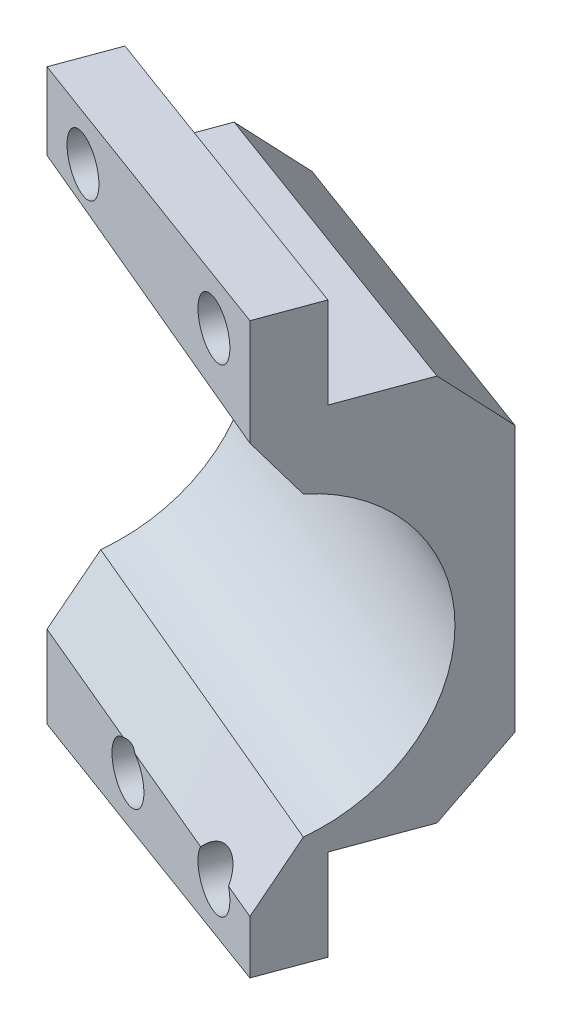
ISO-10303-21;
HEADER;
FILE_DESCRIPTION(('STEP AP214'),'2;1');
FILE_NAME('part.step','',(''),(''),'','','');
FILE_SCHEMA(('AUTOMOTIVE_DESIGN { 1 0 10303 214 1 1 1 1 }'));
ENDSEC;
DATA;
#1=APPLICATION_CONTEXT('core data for automotive mechanical design processes');
#2=APPLICATION_PROTOCOL_DEFINITION('international standard','automotive_design',2000,#1);
#3=PRODUCT_CONTEXT('',#1,'mechanical');
#4=PRODUCT('Part','Part','',(#3));
#5=PRODUCT_RELATED_PRODUCT_CATEGORY('part','',(#4));
#6=PRODUCT_DEFINITION_FORMATION('','',#4);
#7=PRODUCT_DEFINITION_CONTEXT('part definition',#1,'design');
#8=PRODUCT_DEFINITION('design','',#6,#7);
#9=PRODUCT_DEFINITION_SHAPE('','',#8);
#10=(LENGTH_UNIT() NAMED_UNIT(*) SI_UNIT(.MILLI.,.METRE.));
#11=(NAMED_UNIT(*) PLANE_ANGLE_UNIT() SI_UNIT($,.RADIAN.));
#12=(NAMED_UNIT(*) SI_UNIT($,.STERADIAN.) SOLID_ANGLE_UNIT());
#13=UNCERTAINTY_MEASURE_WITH_UNIT(LENGTH_MEASURE(1.E-05),#10,'distance_accuracy_value','');
#14=(GEOMETRIC_REPRESENTATION_CONTEXT(3) GLOBAL_UNCERTAINTY_ASSIGNED_CONTEXT((#13)) GLOBAL_UNIT_ASSIGNED_CONTEXT((#10,
#11,#12)) REPRESENTATION_CONTEXT('',''));
#15=CARTESIAN_POINT('',(0.,0.,0.));
#16=DIRECTION('',(0.,0.,1.));
#17=DIRECTION('',(1.,0.,0.));
#18=AXIS2_PLACEMENT_3D('',#15,#16,#17);
#19=CARTESIAN_POINT('',(5.21894467672447,0.,-14.1596198036222));
#20=DIRECTION('',(0.345836204768251,0.,-0.93829490005621));
#21=DIRECTION('',(-0.93829490005621,0.,-0.345836204768251));
#22=AXIS2_PLACEMENT_3D('',#19,#20,#21);
#23=PLANE('',#22);
#24=CARTESIAN_POINT('',(27.3361977123287,-21.59,-6.00765516087053));
#25=DIRECTION('',(0.345836204768251,0.,-0.93829490005621));
#26=DIRECTION('',(-0.93829490005621,0.,-0.345836204768251));
#27=AXIS2_PLACEMENT_3D('',#24,#25,#26);
#28=CIRCLE('',#27,2.25);
#29=CARTESIAN_POINT('',(25.5723718134735,-20.3535634891508,-6.65776511531612));
#30=VERTEX_POINT('',#29);
#31=CARTESIAN_POINT('',(29.2696260313988,-20.6863734350226,-5.29503324209148));
#32=VERTEX_POINT('',#31);
#33=EDGE_CURVE('E75',#30,#32,#28,.F.);
#34=ORIENTED_EDGE('',*,*,#33,.F.);
#35=CARTESIAN_POINT('',(3.48371722712131,-18.3651246267416,-14.7991889577811));
#36=CARTESIAN_POINT('',(13.4826763632401,-19.2652909730915,-11.113778241959));
#37=CARTESIAN_POINT('',(23.4764153445444,-20.164921543379,-7.43029156785319));
#38=CARTESIAN_POINT('',(33.4648246432216,-21.0640064779739,-3.74876930516191));
#39=B_SPLINE_CURVE_WITH_KNOTS('',3,(#35,#36,#37,#38),.UNSPECIFIED.,.F.,.F.,(4,4),
(4.48806593881346,4.49274774978763),.UNSPECIFIED.);
#40=CARTESIAN_POINT('',(16.8746813355846,-19.570610503947,-9.86355496341381));
#41=VERTEX_POINT('',#40);
#42=EDGE_CURVE('E177',#30,#41,#39,.F.);
#43=ORIENTED_EDGE('',*,*,#42,.T.);
#44=CARTESIAN_POINT('',(15.9436553843669,-21.59,-10.2067119831211));
#45=DIRECTION('',(0.345836204768251,0.,-0.93829490005621));
#46=DIRECTION('',(-0.93829490005621,0.,-0.345836204768251));
#47=AXIS2_PLACEMENT_3D('',#44,#45,#46);
#48=CIRCLE('',#47,2.25);
#49=CARTESIAN_POINT('',(15.3436399883833,-19.4327858878662,-10.4278653191747));
#50=VERTEX_POINT('',#49);
#51=EDGE_CURVE('E68',#41,#50,#48,.T.);
#52=ORIENTED_EDGE('',*,*,#51,.T.);
#53=CARTESIAN_POINT('',(3.48371722712131,-18.3651246267416,-14.7991889577811));
#54=CARTESIAN_POINT('',(13.4826763632401,-19.2652909730915,-11.113778241959));
#55=CARTESIAN_POINT('',(23.4764153445444,-20.164921543379,-7.43029156785319));
#56=CARTESIAN_POINT('',(33.4648246432216,-21.0640064779739,-3.74876930516191));
#57=B_SPLINE_CURVE_WITH_KNOTS('',3,(#53,#54,#55,#56),.UNSPECIFIED.,.F.,.F.,(4,4),
(4.48806593881346,4.49274774978763),.UNSPECIFIED.);
#58=CARTESIAN_POINT('',(5.21894467672446,-18.5213395611403,-14.1596198036222));
#59=VERTEX_POINT('',#58);
#60=EDGE_CURVE('E174',#50,#59,#57,.F.);
#61=ORIENTED_EDGE('',*,*,#60,.T.);
#62=DIRECTION('',(0.,1.,0.));
#63=VECTOR('',#62,1.);
#64=CARTESIAN_POINT('',(5.21894467672446,22.225,-14.1596198036222));
#65=LINE('',#64,#63);
#66=CARTESIAN_POINT('',(5.21894467672446,-25.4,-14.1596198036222));
#67=VERTEX_POINT('',#66);
#68=EDGE_CURVE('E419',#67,#59,#65,.T.);
#69=ORIENTED_EDGE('',*,*,#68,.F.);
#70=DIRECTION('',(-0.93829490005621,0.,-0.345836204768251));
#71=VECTOR('',#70,1.);
#72=CARTESIAN_POINT('',(32.1027358046142,-25.4,-4.25080724064782));
#73=LINE('',#72,#71);
#74=CARTESIAN_POINT('',(32.1027358046142,-25.4,-4.25080724064782));
#75=VERTEX_POINT('',#74);
#76=EDGE_CURVE('E418',#75,#67,#73,.T.);
#77=ORIENTED_EDGE('',*,*,#76,.F.);
#78=DIRECTION('',(0.,-1.,0.));
#79=VECTOR('',#78,1.);
#80=CARTESIAN_POINT('',(32.1027358046142,22.225,-4.25080724064782));
#81=LINE('',#80,#79);
#82=CARTESIAN_POINT('',(32.1027358046142,-20.9414006057597,-4.25080724064782));
#83=VERTEX_POINT('',#82);
#84=EDGE_CURVE('E404',#83,#75,#81,.T.);
#85=ORIENTED_EDGE('',*,*,#84,.F.);
#86=CARTESIAN_POINT('',(3.48371722712131,-18.3651246267416,-14.7991889577811));
#87=CARTESIAN_POINT('',(13.4826763632401,-19.2652909730915,-11.113778241959));
#88=CARTESIAN_POINT('',(23.4764153445444,-20.164921543379,-7.43029156785319));
#89=CARTESIAN_POINT('',(33.4648246432216,-21.0640064779739,-3.74876930516191));
#90=B_SPLINE_CURVE_WITH_KNOTS('',3,(#86,#87,#88,#89),.UNSPECIFIED.,.F.,.F.,(4,4),
(4.48806593881346,4.49274774978763),.UNSPECIFIED.);
#91=EDGE_CURVE('E310',#83,#32,#90,.F.);
#92=ORIENTED_EDGE('',*,*,#91,.T.);
#93=EDGE_LOOP('',(#34,#43,#52,#61,#69,#77,#85,#92));
#94=FACE_BOUND('',#93,.T.);
#95=ADVANCED_FACE('F47',(#94),#23,.F.);
#96=CARTESIAN_POINT('',(5.21894467672446,15.8053970494576,-14.1596198036222));
#97=VERTEX_POINT('',#96);
#98=CARTESIAN_POINT('',(5.21894467672446,22.225,-14.1596198036222));
#99=VERTEX_POINT('',#98);
#100=EDGE_CURVE('E337',#97,#99,#65,.T.);
#101=ORIENTED_EDGE('',*,*,#100,.F.);
#102=CARTESIAN_POINT('',(33.841310333405,13.1942518521345,-3.61000442193104));
#103=CARTESIAN_POINT('',(23.8512512987509,14.1056822711107,-7.29213474337748));
#104=CARTESIAN_POINT('',(13.8558640015298,15.0175328893459,-10.9762289528341));
#105=CARTESIAN_POINT('',(3.85525803950884,15.9297937085494,-14.6622466548176));
#106=B_SPLINE_CURVE_WITH_KNOTS('',3,(#102,#103,#104,#105),.UNSPECIFIED.,.F.,.F.,(4,4),
(1.789867230999,1.79455015070473),.UNSPECIFIED.);
#107=CARTESIAN_POINT('',(32.1027358046142,13.3528678380812,-4.25080724064782));
#108=VERTEX_POINT('',#107);
#109=EDGE_CURVE('E170',#97,#108,#106,.F.);
#110=ORIENTED_EDGE('',*,*,#109,.T.);
#111=CARTESIAN_POINT('',(32.1027358046142,22.225,-4.25080724064782));
#112=VERTEX_POINT('',#111);
#113=EDGE_CURVE('E336',#112,#108,#81,.T.);
#114=ORIENTED_EDGE('',*,*,#113,.F.);
#115=DIRECTION('',(0.93829490005621,0.,0.345836204768251));
#116=VECTOR('',#115,1.);
#117=CARTESIAN_POINT('',(32.1027358046142,22.225,-4.25080724064782));
#118=LINE('',#117,#116);
#119=EDGE_CURVE('E528',#99,#112,#118,.T.);
#120=ORIENTED_EDGE('',*,*,#119,.F.);
#121=EDGE_LOOP('',(#101,#110,#114,#120));
#122=FACE_BOUND('',#121,.T.);
#123=CARTESIAN_POINT('',(27.3361977123287,18.415,-6.00765516087053));
#124=DIRECTION('',(0.345836204768251,0.,-0.93829490005621));
#125=DIRECTION('',(-0.93829490005621,0.,-0.345836204768251));
#126=AXIS2_PLACEMENT_3D('',#123,#124,#125);
#127=CIRCLE('',#126,2.25);
#128=CARTESIAN_POINT('',(25.2250341872022,18.415,-6.7857866215991));
#129=VERTEX_POINT('',#128);
#130=EDGE_CURVE('E511',#129,#129,#127,.F.);
#131=ORIENTED_EDGE('',*,*,#130,.F.);
#132=EDGE_LOOP('',(#131));
#133=FACE_BOUND('',#132,.T.);
#134=CARTESIAN_POINT('',(9.98548276901002,18.415,-12.4027718833995));
#135=DIRECTION('',(0.345836204768251,0.,-0.93829490005621));
#136=DIRECTION('',(-0.93829490005621,0.,-0.345836204768251));
#137=AXIS2_PLACEMENT_3D('',#134,#135,#136);
#138=CIRCLE('',#137,2.25);
#139=CARTESIAN_POINT('',(7.87431924388355,18.415,-13.1809033441281));
#140=VERTEX_POINT('',#139);
#141=EDGE_CURVE('E499',#140,#140,#138,.T.);
#142=ORIENTED_EDGE('',*,*,#141,.T.);
#143=EDGE_LOOP('',(#142));
#144=FACE_BOUND('',#143,.T.);
#145=ADVANCED_FACE('F276',(#122,#133,#144),#23,.F.);
#146=CARTESIAN_POINT('',(-32.6193968322197,22.225,-33.5201304715263));
#147=DIRECTION('',(-0.345836204768251,0.,0.93829490005621));
#148=DIRECTION('',(0.93829490005621,0.,0.345836204768251));
#149=AXIS2_PLACEMENT_3D('',#146,#147,#148);
#150=PLANE('',#149);
#151=DIRECTION('',(0.93829490005621,0.,0.345836204768251));
#152=VECTOR('',#151,1.);
#153=CARTESIAN_POINT('',(-32.6193968322197,14.605,-33.5201304715263));
#154=LINE('',#153,#152);
#155=CARTESIAN_POINT('',(6.97579259694718,14.605,-18.9261578959078));
#156=VERTEX_POINT('',#155);
#157=CARTESIAN_POINT('',(33.859583724837,14.605,-9.01734533293336));
#158=VERTEX_POINT('',#157);
#159=EDGE_CURVE('E559',#156,#158,#154,.T.);
#160=ORIENTED_EDGE('',*,*,#159,.F.);
#161=DIRECTION('',(0.,-1.,0.));
#162=VECTOR('',#161,1.);
#163=CARTESIAN_POINT('',(6.97579259694718,22.225,-18.9261578959078));
#164=LINE('',#163,#162);
#165=CARTESIAN_POINT('',(6.97579259694718,22.225,-18.9261578959078));
#166=VERTEX_POINT('',#165);
#167=EDGE_CURVE('E417',#166,#156,#164,.T.);
#168=ORIENTED_EDGE('',*,*,#167,.F.);
#169=DIRECTION('',(0.93829490005621,0.,0.345836204768251));
#170=VECTOR('',#169,1.);
#171=CARTESIAN_POINT('',(-32.6193968322197,22.225,-33.5201304715263));
#172=LINE('',#171,#170);
#173=CARTESIAN_POINT('',(33.859583724837,22.225,-9.01734533293336));
#174=VERTEX_POINT('',#173);
#175=EDGE_CURVE('E541',#166,#174,#172,.T.);
#176=ORIENTED_EDGE('',*,*,#175,.T.);
#177=DIRECTION('',(0.,1.,0.));
#178=VECTOR('',#177,1.);
#179=CARTESIAN_POINT('',(33.859583724837,22.225,-9.01734533293336));
#180=LINE('',#179,#178);
#181=EDGE_CURVE('E531',#158,#174,#180,.T.);
#182=ORIENTED_EDGE('',*,*,#181,.F.);
#183=EDGE_LOOP('',(#160,#168,#176,#182));
#184=FACE_BOUND('',#183,.T.);
#185=CARTESIAN_POINT('',(29.0930456325514,18.415,-10.7741932531561));
#186=DIRECTION('',(-0.345836204768251,0.,0.93829490005621));
#187=DIRECTION('',(0.93829490005621,0.,0.345836204768251));
#188=AXIS2_PLACEMENT_3D('',#185,#186,#187);
#189=CIRCLE('',#188,2.25);
#190=CARTESIAN_POINT('',(31.2042091576779,18.415,-9.99606179242751));
#191=VERTEX_POINT('',#190);
#192=EDGE_CURVE('E587',#191,#191,#189,.F.);
#193=ORIENTED_EDGE('',*,*,#192,.F.);
#194=EDGE_LOOP('',(#193));
#195=FACE_BOUND('',#194,.T.);
#196=CARTESIAN_POINT('',(11.7423306892327,18.415,-17.169309975685));
#197=DIRECTION('',(-0.345836204768251,0.,0.93829490005621));
#198=DIRECTION('',(0.93829490005621,0.,0.345836204768251));
#199=AXIS2_PLACEMENT_3D('',#196,#197,#198);
#200=CIRCLE('',#199,2.25);
#201=CARTESIAN_POINT('',(13.8534942143592,18.415,-16.3911785149565));
#202=VERTEX_POINT('',#201);
#203=EDGE_CURVE('E55',#202,#202,#200,.T.);
#204=ORIENTED_EDGE('',*,*,#203,.T.);
#205=EDGE_LOOP('',(#204));
#206=FACE_BOUND('',#205,.T.);
#207=ADVANCED_FACE('F273',(#184,#195,#206),#150,.F.);
#208=CARTESIAN_POINT('',(-32.6193968322197,-25.4,-33.5201304715263));
#209=DIRECTION('',(-0.345836204768251,0.,0.93829490005621));
#210=DIRECTION('',(0.93829490005621,0.,0.345836204768251));
#211=AXIS2_PLACEMENT_3D('',#208,#209,#210);
#212=PLANE('',#211);
#213=CARTESIAN_POINT('',(17.7005033045897,-21.59,-14.9732500754066));
#214=DIRECTION('',(-0.345836204768251,0.,0.93829490005621));
#215=DIRECTION('',(0.93829490005621,0.,0.345836204768251));
#216=AXIS2_PLACEMENT_3D('',#213,#214,#215);
#217=CIRCLE('',#216,2.25);
#218=CARTESIAN_POINT('',(19.8116668297161,-21.59,-14.1951186146781));
#219=VERTEX_POINT('',#218);
#220=EDGE_CURVE('E180',#219,#219,#217,.T.);
#221=ORIENTED_EDGE('',*,*,#220,.T.);
#222=EDGE_LOOP('',(#221));
#223=FACE_BOUND('',#222,.T.);
#224=DIRECTION('',(0.93829490005621,0.,0.345836204768251));
#225=VECTOR('',#224,1.);
#226=CARTESIAN_POINT('',(-32.6193968322197,-25.4,-33.5201304715263));
#227=LINE('',#226,#225);
#228=CARTESIAN_POINT('',(6.97579259694718,-25.4,-18.9261578959078));
#229=VERTEX_POINT('',#228);
#230=CARTESIAN_POINT('',(33.859583724837,-25.4,-9.01734533293336));
#231=VERTEX_POINT('',#230);
#232=EDGE_CURVE('E351',#229,#231,#227,.T.);
#233=ORIENTED_EDGE('',*,*,#232,.F.);
#234=DIRECTION('',(0.,-1.,0.));
#235=VECTOR('',#234,1.);
#236=CARTESIAN_POINT('',(6.97579259694717,22.225,-18.9261578959077));
#237=LINE('',#236,#235);
#238=CARTESIAN_POINT('',(6.97579259694717,-17.78,-18.9261578959078));
#239=VERTEX_POINT('',#238);
#240=EDGE_CURVE('E515',#239,#229,#237,.T.);
#241=ORIENTED_EDGE('',*,*,#240,.F.);
#242=DIRECTION('',(0.93829490005621,0.,0.345836204768251));
#243=VECTOR('',#242,1.);
#244=CARTESIAN_POINT('',(-32.6193968322197,-17.78,-33.5201304715263));
#245=LINE('',#244,#243);
#246=CARTESIAN_POINT('',(33.859583724837,-17.78,-9.01734533293336));
#247=VERTEX_POINT('',#246);
#248=EDGE_CURVE('E403',#239,#247,#245,.T.);
#249=ORIENTED_EDGE('',*,*,#248,.T.);
#250=DIRECTION('',(0.,1.,0.));
#251=VECTOR('',#250,1.);
#252=CARTESIAN_POINT('',(33.8595837248369,22.225,-9.01734533293334));
#253=LINE('',#252,#251);
#254=EDGE_CURVE('E498',#231,#247,#253,.T.);
#255=ORIENTED_EDGE('',*,*,#254,.F.);
#256=EDGE_LOOP('',(#233,#241,#249,#255));
#257=FACE_BOUND('',#256,.T.);
#258=CARTESIAN_POINT('',(29.0930456325514,-21.59,-10.7741932531561));
#259=DIRECTION('',(-0.345836204768251,0.,0.93829490005621));
#260=DIRECTION('',(0.93829490005621,0.,0.345836204768251));
#261=AXIS2_PLACEMENT_3D('',#258,#259,#260);
#262=CIRCLE('',#261,2.25);
#263=CARTESIAN_POINT('',(31.2042091576779,-21.59,-9.99606179242751));
#264=VERTEX_POINT('',#263);
#265=EDGE_CURVE('E727',#264,#264,#262,.F.);
#266=ORIENTED_EDGE('',*,*,#265,.F.);
#267=EDGE_LOOP('',(#266));
#268=FACE_BOUND('',#267,.T.);
#269=ADVANCED_FACE('F218',(#223,#257,#268),#212,.F.);
#270=CARTESIAN_POINT('',(33.4648246432216,-21.0640064779739,-3.74876930516191));
#271=CARTESIAN_POINT('',(23.4764153445444,-20.164921543379,-7.43029156785319));
#272=CARTESIAN_POINT('',(13.4826763632401,-19.2652909730915,-11.113778241959));
#273=CARTESIAN_POINT('',(3.48371722712131,-18.3651246267416,-14.7991889577811));
#274=CARTESIAN_POINT('',(35.0394517385668,-16.3781680382346,-6.87656600234612));
#275=CARTESIAN_POINT('',(25.0537306828065,-15.4774162398379,-10.5649188001721));
#276=CARTESIAN_POINT('',(15.0626799434032,-14.576135924212,-14.2552401872516));
#277=CARTESIAN_POINT('',(5.06640901870838,-13.6743369690675,-17.9474897189804));
#278=B_SPLINE_SURFACE_WITH_KNOTS('',1,3,((#270,#271,#272,#273),(#274,#275,#276,#277)),
.UNSPECIFIED.,.F.,.F.,.F.,(2,2),(4,4),(0.,1.),(4.48806593881346,4.49274774978763),.UNSPECIFIED.);
#279=CARTESIAN_POINT('',(25.5723675417675,-20.3535704106601,-6.65776668977912));
#280=CARTESIAN_POINT('',(25.6658919236658,-20.248038897976,-6.71094198352431));
#281=CARTESIAN_POINT('',(25.7681177063654,-20.1465929894518,-6.75836717979774));
#282=CARTESIAN_POINT('',(25.9890287802887,-19.9553434568224,-6.83932891592552));
#283=CARTESIAN_POINT('',(26.107819049372,-19.8656217769322,-6.87277095779081));
#284=CARTESIAN_POINT('',(26.336696903585,-19.7176327216791,-6.91806125044306));
#285=CARTESIAN_POINT('',(26.444429225068,-19.6566127566288,-6.93273302071016));
#286=CARTESIAN_POINT('',(26.6675183149703,-19.5485450351687,-6.94904256948124));
#287=CARTESIAN_POINT('',(26.7828568956408,-19.5014653278813,-6.95071037886424));
#288=CARTESIAN_POINT('',(26.9599412262747,-19.4432148744101,-6.94247545844867));
#289=CARTESIAN_POINT('',(27.0199595623208,-19.4258040201822,-6.93789067668754));
#290=CARTESIAN_POINT('',(27.1407316031991,-19.3955657368751,-6.92497508185962));
#291=CARTESIAN_POINT('',(27.2014849063647,-19.3827359116977,-6.91664623228521));
#292=CARTESIAN_POINT('',(27.323187655381,-19.3619497040714,-6.89618121886951));
#293=CARTESIAN_POINT('',(27.3841370904549,-19.3539930583057,-6.88404526079465));
#294=CARTESIAN_POINT('',(27.5055935045541,-19.3431614001366,-6.85599750396601));
#295=CARTESIAN_POINT('',(27.566100555667,-19.3402855405582,-6.84008633519623));
#296=CARTESIAN_POINT('',(27.729450546464,-19.3395653829891,-6.79171421031224));
#297=CARTESIAN_POINT('',(27.8313098150825,-19.3468548113742,-6.75559980489577));
#298=CARTESIAN_POINT('',(28.0284923192813,-19.3767859448595,-6.67352393299059));
#299=CARTESIAN_POINT('',(28.1238177573626,-19.399422448282,-6.62756580650343));
#300=CARTESIAN_POINT('',(28.3005967330483,-19.4573369418536,-6.5300859169327));
#301=CARTESIAN_POINT('',(28.3825118797786,-19.4919037353106,-6.47897265779519));
#302=CARTESIAN_POINT('',(28.5364715765224,-19.5722442416282,-6.37108811365264));
#303=CARTESIAN_POINT('',(28.6085149056802,-19.6180193386814,-6.31431613032565));
#304=CARTESIAN_POINT('',(28.747091130375,-19.7229817197728,-6.19211364865386));
#305=CARTESIAN_POINT('',(28.8127439257845,-19.7829411053385,-6.12635335679033));
#306=CARTESIAN_POINT('',(28.931269361501,-19.9117457595582,-5.99183246224557));
#307=CARTESIAN_POINT('',(28.9841145475068,-19.9806096399651,-5.92306578085097));
#308=CARTESIAN_POINT('',(29.0846821992871,-20.1370778757118,-5.77266328165362));
#309=CARTESIAN_POINT('',(29.1301222164868,-20.2258998567653,-5.69077557176296));
#310=CARTESIAN_POINT('',(29.2042646348731,-20.4100307635348,-5.52702994956708));
#311=CARTESIAN_POINT('',(29.2329858958113,-20.5053322438708,-5.44517210819284));
#312=CARTESIAN_POINT('',(29.2597063448224,-20.6304858010472,-5.34096843829733));
#313=CARTESIAN_POINT('',(29.264980850666,-20.6583594350818,-5.31796338544579));
#314=CARTESIAN_POINT('',(29.2696254418299,-20.6863808737219,-5.29503345939496));
#315=B_SPLINE_CURVE_WITH_KNOTS('',3,(#279,#280,#281,#282,#283,#284,#285,#286,#287,#288,#289,
#290,#291,#292,#293,#294,#295,#296,#297,#298,#299,#300,#301,#302,#303,#304,#305,#306,#307,#308,
#309,#310,#311,#312,#313,#314),.UNSPECIFIED.,.F.,.F.,(4,2,2,2,2,2,2,2,2,2,2,2,2,2,2,2,2,4),(0.,
0.452526476443792,0.908063536875264,1.28063559026258,1.65234698358403,1.84009173480877,
2.02773814216507,2.2153744093637,2.40297938696811,2.72607191042478,3.04905498087461,
3.35540178165932,3.66178643447169,3.99228746776103,4.32349081595369,4.70932053977421,
5.0947141770203,5.20425640182945),.UNSPECIFIED.);
#316=EDGE_CURVE('E11',#30,#32,#315,.T.);
#317=CARTESIAN_POINT('',(32.1027358046168,-20.9414006057603,-4.25080724064688));
#318=CARTESIAN_POINT('',(32.1528873311063,-20.7447541654978,-4.38687471928442));
#319=CARTESIAN_POINT('',(32.2030391387433,-20.5481082900096,-4.52294291051614));
#320=CARTESIAN_POINT('',(32.303343769522,-20.1548158915203,-4.79508194777464));
#321=CARTESIAN_POINT('',(32.3534965926687,-19.9581693685294,-4.93115279381429));
#322=CARTESIAN_POINT('',(32.4538032544727,-19.5648756750658,-5.20329714069402));
#323=CARTESIAN_POINT('',(32.5039570931351,-19.3682285046034,-5.33937064154698));
#324=CARTESIAN_POINT('',(32.6042657859682,-18.9749335162274,-5.61152029806161));
#325=CARTESIAN_POINT('',(32.654420640144,-18.7782856983241,-5.74759645373615));
#326=CARTESIAN_POINT('',(32.7547313640003,-18.3849894150971,-6.01975141990267));
#327=CARTESIAN_POINT('',(32.804887233686,-18.1883409497836,-6.15583023040753));
#328=CARTESIAN_POINT('',(32.9051999885721,-17.7950433717676,-6.42799050623872));
#329=CARTESIAN_POINT('',(32.9553568737777,-17.5983942590753,-6.56407197157793));
#330=CARTESIAN_POINT('',(33.0556716596947,-17.205095386332,-6.83623755708835));
#331=CARTESIAN_POINT('',(33.1058295604112,-17.0084456262913,-6.97232167727244));
#332=CARTESIAN_POINT('',(33.2061463773576,-16.6151454588824,-7.24449257247754));
#333=CARTESIAN_POINT('',(33.2563052935925,-16.4184950515245,-7.38057934751143));
#334=CARTESIAN_POINT('',(33.3064644909653,-16.2218452089948,-7.51666683511446));
#335=B_SPLINE_CURVE_WITH_KNOTS('',3,(#317,#318,#319,#320,#321,#322,#323,#324,#325,#326,#327,
#328,#329,#330,#331,#332,#333,#334),.UNSPECIFIED.,.F.,.F.,(4,2,2,2,2,2,2,2,4),(0.,
0.733003554818525,1.46601373369241,2.19903053660328,2.93205396353403,3.66508401446753,
4.39812068938543,5.13116398827103,5.86421391110596),.UNSPECIFIED.);
#336=CARTESIAN_POINT('',(33.3064644909668,-16.2218452089928,-7.51666683511342));
#337=VERTEX_POINT('',#336);
#338=EDGE_CURVE('E359',#337,#83,#335,.F.);
#339=CARTESIAN_POINT('',(35.0394517385668,-16.3781680382346,-6.87656600234612));
#340=CARTESIAN_POINT('',(25.0537306828065,-15.4774162398379,-10.5649188001721));
#341=CARTESIAN_POINT('',(15.0626799434032,-14.576135924212,-14.2552401872516));
#342=CARTESIAN_POINT('',(5.06640901870838,-13.6743369690675,-17.9474897189804));
#343=B_SPLINE_CURVE_WITH_KNOTS('',3,(#339,#340,#341,#342),.UNSPECIFIED.,.F.,.F.,(4,4),
(4.48806593881346,4.49274774978763),.UNSPECIFIED.);
#344=CARTESIAN_POINT('',(6.42950450507748,-13.7973063382051,-17.4440131016514));
#345=VERTEX_POINT('',#344);
#346=EDGE_CURVE('E189',#345,#337,#343,.F.);
#347=CARTESIAN_POINT('',(6.42950450508037,-13.7973063382072,-17.4440131016508));
#348=CARTESIAN_POINT('',(6.37906067477359,-13.9941427122614,-17.3071533651133));
#349=CARTESIAN_POINT('',(6.32861712555426,-14.1909796542198,-17.1702943417516));
#350=CARTESIAN_POINT('',(6.22773104322728,-14.5846529026838,-16.8965789529429));
#351=CARTESIAN_POINT('',(6.17728851011458,-14.7814892091792,-16.7597225874829));
#352=CARTESIAN_POINT('',(6.07640446000391,-15.1751611866865,-16.486012514469));
#353=CARTESIAN_POINT('',(6.02596294300089,-15.3719968576882,-16.3491588069022));
#354=CARTESIAN_POINT('',(5.92508092510119,-15.7656675641767,-16.0754540496704));
#355=CARTESIAN_POINT('',(5.87464042419946,-15.9625025996533,-15.9386029999924));
#356=CARTESIAN_POINT('',(5.77376043850539,-16.3561720350609,-15.6649035585297));
#357=CARTESIAN_POINT('',(5.72332095370799,-16.5530064349817,-15.5280551667321));
#358=CARTESIAN_POINT('',(5.62244300022566,-16.9466745992471,-15.2543610410218));
#359=CARTESIAN_POINT('',(5.57200453153566,-17.1435083635815,-15.1175153070961));
#360=CARTESIAN_POINT('',(5.47112861025972,-17.5371752566426,-14.8438264971253));
#361=CARTESIAN_POINT('',(5.42069115766872,-17.7340083853591,-14.7069834210672));
#362=CARTESIAN_POINT('',(5.31981726859383,-18.1276740071538,-14.4332999268229));
#363=CARTESIAN_POINT('',(5.26938083210489,-18.3245065002218,-14.2964595086239));
#364=CARTESIAN_POINT('',(5.21894467672465,-18.5213395611403,-14.1596198036222));
#365=B_SPLINE_CURVE_WITH_KNOTS('',3,(#347,#348,#349,#350,#351,#352,#353,#354,#355,#356,#357,
#358,#359,#360,#361,#362,#363,#364),.UNSPECIFIED.,.F.,.F.,(4,2,2,2,2,2,2,2,4),(0.,
0.734967707362013,1.46992880102988,2.20488328098643,2.93983114721322,3.6747723996931,
4.40970703840887,5.14463506334211,5.87955647447566),.UNSPECIFIED.);
#366=EDGE_CURVE('E186',#59,#345,#365,.F.);
#367=CARTESIAN_POINT('',(16.8747038270419,-19.5706222820676,-9.86354667352519));
#368=CARTESIAN_POINT('',(16.8369556336182,-19.548380013701,-9.89197570997099));
#369=CARTESIAN_POINT('',(16.797863877301,-19.5275356147437,-9.919730335302));
#370=CARTESIAN_POINT('',(16.7171739399046,-19.4888463614832,-9.97367953625255));
#371=CARTESIAN_POINT('',(16.6755747578716,-19.4710027159859,-9.99987348044603));
#372=CARTESIAN_POINT('',(16.5901337207534,-19.4385568898936,-10.0504358784923));
#373=CARTESIAN_POINT('',(16.5462946769958,-19.42395076306,-10.0748065304866));
#374=CARTESIAN_POINT('',(16.4566169602477,-19.3981275983925,-10.1215357028725));
#375=CARTESIAN_POINT('',(16.4107786238776,-19.3869099925357,-10.1438945600625));
#376=CARTESIAN_POINT('',(16.270401044291,-19.3585005943878,-10.2077885807026));
#377=CARTESIAN_POINT('',(16.173189643863,-19.3466250322936,-10.2460281215654));
#378=CARTESIAN_POINT('',(15.9748047134806,-19.337578694863,-10.3123635172354));
#379=CARTESIAN_POINT('',(15.8736334858326,-19.3403994972622,-10.34046517204));
#380=CARTESIAN_POINT('',(15.7004175336523,-19.3572979892748,-10.3792782182203));
#381=CARTESIAN_POINT('',(15.6285888892667,-19.3678077381384,-10.3926742955917));
#382=CARTESIAN_POINT('',(15.4854808114946,-19.395445859393,-10.4142014984722));
#383=CARTESIAN_POINT('',(15.4142009389616,-19.4125682184323,-10.4223373895467));
#384=CARTESIAN_POINT('',(15.3436170208965,-19.4327931439075,-10.427873784518));
#385=B_SPLINE_CURVE_WITH_KNOTS('',3,(#367,#368,#369,#370,#371,#372,#373,#374,#375,#376,#377,
#378,#379,#380,#381,#382,#383,#384),.UNSPECIFIED.,.F.,.F.,(4,2,2,2,2,2,2,2,4),(0.,
0.156658807989202,0.313380573099521,0.469910245207447,0.626413663431772,0.940110675150718,
1.25362793163298,1.47461686703845,1.69540531173383),.UNSPECIFIED.);
#386=EDGE_CURVE('E61',#41,#50,#385,.T.);
#387=ORIENTED_EDGE('',*,*,#42,.F.);
#388=ORIENTED_EDGE('',*,*,#316,.T.);
#389=ORIENTED_EDGE('',*,*,#91,.F.);
#390=ORIENTED_EDGE('',*,*,#338,.F.);
#391=ORIENTED_EDGE('',*,*,#346,.F.);
#392=ORIENTED_EDGE('',*,*,#366,.F.);
#393=ORIENTED_EDGE('',*,*,#60,.F.);
#394=ORIENTED_EDGE('',*,*,#386,.F.);
#395=EDGE_LOOP('',(#387,#388,#389,#390,#391,#392,#393,#394));
#396=FACE_BOUND('',#395,.T.);
#397=ADVANCED_FACE('F184',(#396),#278,.T.);
#398=CARTESIAN_POINT('',(38.0760187333715,22.225,-20.4570367544187));
#399=DIRECTION('',(-0.93829490005621,0.,-0.345836204768251));
#400=DIRECTION('',(-0.345836204768251,0.,0.93829490005621));
#401=AXIS2_PLACEMENT_3D('',#398,#399,#400);
#402=PLANE('',#401);
#403=DIRECTION('',(0.345836204768251,0.,-0.93829490005621));
#404=VECTOR('',#403,1.);
#405=CARTESIAN_POINT('',(38.0760187333715,-17.78,-20.4570367544187));
#406=LINE('',#405,#404);
#407=CARTESIAN_POINT('',(36.3191708131488,-17.78,-15.6904986621331));
#408=VERTEX_POINT('',#407);
#409=EDGE_CURVE('E503',#247,#408,#406,.T.);
#410=ORIENTED_EDGE('',*,*,#409,.T.);
#411=DIRECTION('',(0.244543125571449,0.707106781186549,-0.663474686582499));
#412=VECTOR('',#411,1.);
#413=CARTESIAN_POINT('',(36.3191708131488,-17.78,-15.6904986621331));
#414=LINE('',#413,#412);
#415=CARTESIAN_POINT('',(38.0760187333715,-12.7,-20.4570367544187));
#416=VERTEX_POINT('',#415);
#417=EDGE_CURVE('E469',#408,#416,#414,.T.);
#418=ORIENTED_EDGE('',*,*,#417,.T.);
#419=DIRECTION('',(0.,-1.,0.));
#420=VECTOR('',#419,1.);
#421=CARTESIAN_POINT('',(38.0760187333715,22.225,-20.4570367544187));
#422=LINE('',#421,#420);
#423=CARTESIAN_POINT('',(38.0760187333715,9.52499999999999,-20.4570367544187));
#424=VERTEX_POINT('',#423);
#425=EDGE_CURVE('E539',#424,#416,#422,.T.);
#426=ORIENTED_EDGE('',*,*,#425,.F.);
#427=DIRECTION('',(-0.244543125571449,0.707106781186548,0.663474686582499));
#428=VECTOR('',#427,1.);
#429=CARTESIAN_POINT('',(36.3191708131488,14.605,-15.6904986621331));
#430=LINE('',#429,#428);
#431=CARTESIAN_POINT('',(36.3191708131488,14.605,-15.6904986621331));
#432=VERTEX_POINT('',#431);
#433=EDGE_CURVE('E386',#424,#432,#430,.T.);
#434=ORIENTED_EDGE('',*,*,#433,.T.);
#435=DIRECTION('',(-0.345836204768251,0.,0.93829490005621));
#436=VECTOR('',#435,1.);
#437=CARTESIAN_POINT('',(38.0760187333715,14.605,-20.4570367544187));
#438=LINE('',#437,#436);
#439=EDGE_CURVE('E545',#432,#158,#438,.T.);
#440=ORIENTED_EDGE('',*,*,#439,.T.);
#441=ORIENTED_EDGE('',*,*,#181,.T.);
#442=DIRECTION('',(-0.345836204768251,0.,0.93829490005621));
#443=VECTOR('',#442,1.);
#444=CARTESIAN_POINT('',(38.0760187333715,22.225,-20.4570367544187));
#445=LINE('',#444,#443);
#446=EDGE_CURVE('E348',#174,#112,#445,.T.);
#447=ORIENTED_EDGE('',*,*,#446,.T.);
#448=ORIENTED_EDGE('',*,*,#113,.T.);
#449=CARTESIAN_POINT('',(33.3060926675193,8.63410152134006,-7.51565803372207));
#450=CARTESIAN_POINT('',(33.2559564752262,8.83071506481356,-7.37963279561762));
#451=CARTESIAN_POINT('',(33.2058200240692,9.02732803600563,-7.24360682573849));
#452=CARTESIAN_POINT('',(33.1055461451596,9.42055463332209,-6.97155217748076));
#453=CARTESIAN_POINT('',(33.0554087174022,9.61716825943601,-6.83552349908877));
#454=CARTESIAN_POINT('',(32.9551328852865,10.0103961665646,-6.56346343379967));
#455=CARTESIAN_POINT('',(32.9049944809233,10.2070104475687,-6.42743204688917));
#456=CARTESIAN_POINT('',(32.8047166955925,10.600239664446,-6.15536656455657));
#457=CARTESIAN_POINT('',(32.7545773146202,10.7968546003087,-6.01933246912107));
#458=CARTESIAN_POINT('',(32.6542975760676,11.1900851268712,-5.74726156973209));
#459=CARTESIAN_POINT('',(32.6041572184826,11.3867007175606,-5.6112247657652));
#460=CARTESIAN_POINT('',(32.5038755266998,11.779932553745,-5.33914844930755));
#461=CARTESIAN_POINT('',(32.4537341924973,11.9765487992295,-5.20310893680339));
#462=CARTESIAN_POINT('',(32.3534505474745,12.3697819449724,-4.93102720326533));
#463=CARTESIAN_POINT('',(32.3033082366495,12.5663988452203,-4.79498498221803));
#464=CARTESIAN_POINT('',(32.2030226383783,12.9596333004584,-4.52289783158727));
#465=CARTESIAN_POINT('',(32.1528793509273,13.156250855438,-4.38685290199041));
#466=CARTESIAN_POINT('',(32.1027358046139,13.3528678380812,-4.25080724064811));
#467=B_SPLINE_CURVE_WITH_KNOTS('',3,(#449,#450,#451,#452,#453,#454,#455,#456,#457,#458,#459,
#460,#461,#462,#463,#464,#465,#466),.UNSPECIFIED.,.F.,.F.,(4,2,2,2,2,2,2,2,4),(0.,
0.732844115691194,1.46569493872175,2.19855246907387,2.93141670672945,3.66428765167037,
4.39716530387873,5.13004966333663,5.86294073002595),.UNSPECIFIED.);
#468=CARTESIAN_POINT('',(33.3060926675191,8.63410152133815,-7.51565803372165));
#469=VERTEX_POINT('',#468);
#470=EDGE_CURVE('E343',#108,#469,#467,.F.);
#471=ORIENTED_EDGE('',*,*,#470,.T.);
#472=CARTESIAN_POINT('',(32.3315186622503,-3.79459493397972,-4.87152243928929));
#473=DIRECTION('',(-0.93829490005621,0.,-0.345836204768251));
#474=DIRECTION('',(0.01018251460173,0.999566455853083,-0.0276263774261388));
#475=AXIS2_PLACEMENT_3D('',#472,#473,#474);
#476=ELLIPSE('',#475,12.7458703931447,12.7);
#477=EDGE_CURVE('E394',#337,#469,#476,.F.);
#478=ORIENTED_EDGE('',*,*,#477,.F.);
#479=ORIENTED_EDGE('',*,*,#338,.T.);
#480=ORIENTED_EDGE('',*,*,#84,.T.);
#481=DIRECTION('',(-0.345836204768251,0.,0.93829490005621));
#482=VECTOR('',#481,1.);
#483=CARTESIAN_POINT('',(38.0760187333715,-25.4,-20.4570367544187));
#484=LINE('',#483,#482);
#485=EDGE_CURVE('E520',#231,#75,#484,.T.);
#486=ORIENTED_EDGE('',*,*,#485,.F.);
#487=ORIENTED_EDGE('',*,*,#254,.T.);
#488=EDGE_LOOP('',(#410,#418,#426,#434,#440,#441,#447,#448,#471,#478,#479,#480,#486,#487));
#489=FACE_BOUND('',#488,.T.);
#490=ADVANCED_FACE('F217',(#489),#402,.F.);
#491=CARTESIAN_POINT('',(38.0760187333715,-25.4,-20.4570367544187));
#492=DIRECTION('',(0.,1.,0.));
#493=DIRECTION('',(0.,0.,1.));
#494=AXIS2_PLACEMENT_3D('',#491,#492,#493);
#495=PLANE('',#494);
#496=DIRECTION('',(-0.345836204768251,0.,0.93829490005621));
#497=VECTOR('',#496,1.);
#498=CARTESIAN_POINT('',(11.1922276054817,-25.4,-30.3658493173931));
#499=LINE('',#498,#497);
#500=EDGE_CURVE('E423',#229,#67,#499,.T.);
#501=ORIENTED_EDGE('',*,*,#500,.F.);
#502=ORIENTED_EDGE('',*,*,#232,.T.);
#503=ORIENTED_EDGE('',*,*,#485,.T.);
#504=ORIENTED_EDGE('',*,*,#76,.T.);
#505=EDGE_LOOP('',(#501,#502,#503,#504));
#506=FACE_BOUND('',#505,.T.);
#507=ADVANCED_FACE('F255',(#506),#495,.F.);
#508=CARTESIAN_POINT('',(11.1922276054817,22.225,-30.3658493173931));
#509=DIRECTION('',(0.93829490005621,0.,0.345836204768251));
#510=DIRECTION('',(0.345836204768251,0.,-0.93829490005621));
#511=AXIS2_PLACEMENT_3D('',#508,#509,#510);
#512=PLANE('',#511);
#513=DIRECTION('',(0.,1.,0.));
#514=VECTOR('',#513,1.);
#515=CARTESIAN_POINT('',(11.1922276054817,22.225,-30.3658493173931));
#516=LINE('',#515,#514);
#517=CARTESIAN_POINT('',(11.1922276054817,-12.7,-30.3658493173931));
#518=VERTEX_POINT('',#517);
#519=CARTESIAN_POINT('',(11.1922276054817,9.52499999999999,-30.3658493173931));
#520=VERTEX_POINT('',#519);
#521=EDGE_CURVE('E534',#518,#520,#516,.T.);
#522=ORIENTED_EDGE('',*,*,#521,.F.);
#523=DIRECTION('',(-0.244543125571449,-0.707106781186549,0.663474686582499));
#524=VECTOR('',#523,1.);
#525=CARTESIAN_POINT('',(9.43537968525898,-17.78,-25.5993112251075));
#526=LINE('',#525,#524);
#527=CARTESIAN_POINT('',(9.43537968525898,-17.78,-25.5993112251075));
#528=VERTEX_POINT('',#527);
#529=EDGE_CURVE('E453',#518,#528,#526,.T.);
#530=ORIENTED_EDGE('',*,*,#529,.T.);
#531=DIRECTION('',(-0.345836204768251,0.,0.93829490005621));
#532=VECTOR('',#531,1.);
#533=CARTESIAN_POINT('',(11.1922276054817,-17.78,-30.3658493173931));
#534=LINE('',#533,#532);
#535=EDGE_CURVE('E519',#528,#239,#534,.T.);
#536=ORIENTED_EDGE('',*,*,#535,.T.);
#537=ORIENTED_EDGE('',*,*,#240,.T.);
#538=ORIENTED_EDGE('',*,*,#500,.T.);
#539=ORIENTED_EDGE('',*,*,#68,.T.);
#540=ORIENTED_EDGE('',*,*,#366,.T.);
#541=CARTESIAN_POINT('',(5.47254613917714,-1.35827681156375,-14.8476708393018));
#542=DIRECTION('',(0.93829490005621,0.,0.345836204768251));
#543=DIRECTION('',(0.01018251460173,0.999566455853083,-0.0276263774261387));
#544=AXIS2_PLACEMENT_3D('',#541,#542,#543);
#545=ELLIPSE('',#544,12.7458703931447,12.7);
#546=CARTESIAN_POINT('',(6.42913127314569,11.08217289193,-17.4430004788742));
#547=VERTEX_POINT('',#546);
#548=EDGE_CURVE('E388',#547,#345,#545,.F.);
#549=ORIENTED_EDGE('',*,*,#548,.F.);
#550=CARTESIAN_POINT('',(5.21894467672383,15.8053970494576,-14.1596198036226));
#551=CARTESIAN_POINT('',(5.26937280016396,15.6085943690347,-14.2964375507233));
#552=CARTESIAN_POINT('',(5.31980066437835,15.4117911133093,-14.4332545658369));
#553=CARTESIAN_POINT('',(5.42065541488159,15.0181852444023,-14.7068858854748));
#554=CARTESIAN_POINT('',(5.47108230117517,14.8213826312313,-14.8437001900125));
#555=CARTESIAN_POINT('',(5.57193509584052,14.4277780474649,-15.1173260885048));
#556=CARTESIAN_POINT('',(5.62236100421701,14.2309760768801,-15.2541376824728));
#557=CARTESIAN_POINT('',(5.72321184305155,13.8373727783179,-15.5277581598319));
#558=CARTESIAN_POINT('',(5.77363677351432,13.640571450351,-15.6645670432365));
#559=CARTESIAN_POINT('',(5.87448565652627,13.2469694370564,-15.9381820994746));
#560=CARTESIAN_POINT('',(5.92490960908018,13.0501687517392,-16.0749882723214));
#561=CARTESIAN_POINT('',(6.02575653627928,12.6565680237755,-16.3485979074499));
#562=CARTESIAN_POINT('',(6.07617951092919,12.4597679811395,-16.4854013697448));
#563=CARTESIAN_POINT('',(6.17702448232366,12.0661685385702,-16.7590055837757));
#564=CARTESIAN_POINT('',(6.22744647907294,11.8693691386473,-16.895806335525));
#565=CARTESIAN_POINT('',(6.32828949466986,11.4757709815358,-17.1694051284709));
#566=CARTESIAN_POINT('',(6.37871051352223,11.2789722243578,-17.3062031696808));
#567=CARTESIAN_POINT('',(6.4291312731459,11.0821728919322,-17.4430004788747));
#568=B_SPLINE_CURVE_WITH_KNOTS('',3,(#550,#551,#552,#553,#554,#555,#556,#557,#558,#559,#560,
#561,#562,#563,#564,#565,#566,#567),.UNSPECIFIED.,.F.,.F.,(4,2,2,2,2,2,2,2,4),(0.,
0.734806422937613,1.46960615077769,2.20439918350208,2.9391855210926,3.6739651635313,
4.40873811080024,5.14350436288124,5.87826391975613),.UNSPECIFIED.);
#569=EDGE_CURVE('E427',#547,#97,#568,.F.);
#570=ORIENTED_EDGE('',*,*,#569,.T.);
#571=ORIENTED_EDGE('',*,*,#100,.T.);
#572=DIRECTION('',(-0.345836204768251,0.,0.93829490005621));
#573=VECTOR('',#572,1.);
#574=CARTESIAN_POINT('',(11.1922276054817,22.225,-30.3658493173931));
#575=LINE('',#574,#573);
#576=EDGE_CURVE('E422',#166,#99,#575,.T.);
#577=ORIENTED_EDGE('',*,*,#576,.F.);
#578=ORIENTED_EDGE('',*,*,#167,.T.);
#579=DIRECTION('',(0.345836204768251,0.,-0.93829490005621));
#580=VECTOR('',#579,1.);
#581=CARTESIAN_POINT('',(11.1922276054817,14.605,-30.3658493173931));
#582=LINE('',#581,#580);
#583=CARTESIAN_POINT('',(9.43537968525898,14.605,-25.5993112251075));
#584=VERTEX_POINT('',#583);
#585=EDGE_CURVE('E549',#156,#584,#582,.T.);
#586=ORIENTED_EDGE('',*,*,#585,.T.);
#587=DIRECTION('',(0.244543125571449,-0.707106781186548,-0.663474686582499));
#588=VECTOR('',#587,1.);
#589=CARTESIAN_POINT('',(9.43537968525898,14.605,-25.5993112251075));
#590=LINE('',#589,#588);
#591=EDGE_CURVE('E445',#584,#520,#590,.T.);
#592=ORIENTED_EDGE('',*,*,#591,.T.);
#593=EDGE_LOOP('',(#522,#530,#536,#537,#538,#539,#540,#549,#570,#571,#577,#578,#586,#592));
#594=FACE_BOUND('',#593,.T.);
#595=ADVANCED_FACE('F258',(#594),#512,.F.);
#596=CARTESIAN_POINT('',(38.0760187333715,22.225,-20.4570367544187));
#597=DIRECTION('',(0.,-1.,0.));
#598=DIRECTION('',(0.,0.,-1.));
#599=AXIS2_PLACEMENT_3D('',#596,#597,#598);
#600=PLANE('',#599);
#601=ORIENTED_EDGE('',*,*,#446,.F.);
#602=ORIENTED_EDGE('',*,*,#175,.F.);
#603=ORIENTED_EDGE('',*,*,#576,.T.);
#604=ORIENTED_EDGE('',*,*,#119,.T.);
#605=EDGE_LOOP('',(#601,#602,#603,#604));
#606=FACE_BOUND('',#605,.T.);
#607=ADVANCED_FACE('F260',(#606),#600,.F.);
#608=CARTESIAN_POINT('',(11.1922276054817,0.,-30.3658493173931));
#609=DIRECTION('',(0.345836204768251,0.,-0.93829490005621));
#610=DIRECTION('',(-0.93829490005621,0.,-0.345836204768251));
#611=AXIS2_PLACEMENT_3D('',#608,#609,#610);
#612=PLANE('',#611);
#613=ORIENTED_EDGE('',*,*,#425,.T.);
#614=DIRECTION('',(-0.93829490005621,0.,-0.345836204768251));
#615=VECTOR('',#614,1.);
#616=CARTESIAN_POINT('',(11.1922276054817,-12.7,-30.3658493173931));
#617=LINE('',#616,#615);
#618=EDGE_CURVE('E413',#416,#518,#617,.T.);
#619=ORIENTED_EDGE('',*,*,#618,.T.);
#620=ORIENTED_EDGE('',*,*,#521,.T.);
#621=DIRECTION('',(0.93829490005621,0.,0.345836204768251));
#622=VECTOR('',#621,1.);
#623=CARTESIAN_POINT('',(38.0760187333715,9.52499999999999,-20.4570367544187));
#624=LINE('',#623,#622);
#625=EDGE_CURVE('E464',#520,#424,#624,.T.);
#626=ORIENTED_EDGE('',*,*,#625,.T.);
#627=EDGE_LOOP('',(#613,#619,#620,#626));
#628=FACE_BOUND('',#627,.T.);
#629=ADVANCED_FACE('F263',(#628),#612,.T.);
#630=CARTESIAN_POINT('',(-28.4029618236852,14.605,-44.9598218930116));
#631=DIRECTION('',(0.,-1.,0.));
#632=DIRECTION('',(0.,0.,-1.));
#633=AXIS2_PLACEMENT_3D('',#630,#631,#632);
#634=PLANE('',#633);
#635=ORIENTED_EDGE('',*,*,#439,.F.);
#636=DIRECTION('',(-0.93829490005621,0.,-0.345836204768251));
#637=VECTOR('',#636,1.);
#638=CARTESIAN_POINT('',(9.43537968525898,14.605,-25.5993112251075));
#639=LINE('',#638,#637);
#640=EDGE_CURVE('E456',#432,#584,#639,.T.);
#641=ORIENTED_EDGE('',*,*,#640,.T.);
#642=ORIENTED_EDGE('',*,*,#585,.F.);
#643=ORIENTED_EDGE('',*,*,#159,.T.);
#644=EDGE_LOOP('',(#635,#641,#642,#643));
#645=FACE_BOUND('',#644,.T.);
#646=ADVANCED_FACE('F267',(#645),#634,.F.);
#647=CARTESIAN_POINT('',(-28.4029618236852,-17.78,-44.9598218930116));
#648=DIRECTION('',(0.,1.,0.));
#649=DIRECTION('',(0.,0.,1.));
#650=AXIS2_PLACEMENT_3D('',#647,#648,#649);
#651=PLANE('',#650);
#652=ORIENTED_EDGE('',*,*,#535,.F.);
#653=DIRECTION('',(0.93829490005621,0.,0.345836204768251));
#654=VECTOR('',#653,1.);
#655=CARTESIAN_POINT('',(36.3191708131488,-17.78,-15.6904986621331));
#656=LINE('',#655,#654);
#657=EDGE_CURVE('E360',#528,#408,#656,.T.);
#658=ORIENTED_EDGE('',*,*,#657,.T.);
#659=ORIENTED_EDGE('',*,*,#409,.F.);
#660=ORIENTED_EDGE('',*,*,#248,.F.);
#661=EDGE_LOOP('',(#652,#658,#659,#660));
#662=FACE_BOUND('',#661,.T.);
#663=ADVANCED_FACE('F271',(#662),#651,.F.);
#664=CARTESIAN_POINT('',(696.587375950818,-64.0477778002589,241.851057964544));
#665=DIRECTION('',(-0.934055024894211,0.0847260699391449,-0.34693328399354));
#666=DIRECTION('',(0.225267927018769,0.893590671610321,-0.388265466746249));
#667=AXIS2_PLACEMENT_3D('',#664,#665,#666);
#668=CYLINDRICAL_SURFACE('',#667,12.7);
#669=ORIENTED_EDGE('',*,*,#548,.T.);
#670=ORIENTED_EDGE('',*,*,#346,.T.);
#671=ORIENTED_EDGE('',*,*,#477,.T.);
#672=CARTESIAN_POINT('',(4.68929897707967,11.240636506004,-18.0856293361152));
#673=CARTESIAN_POINT('',(14.6874771812781,10.3300069936028,-14.3926769474977));
#674=CARTESIAN_POINT('',(24.680439421565,9.41980482087188,-10.7016511375424));
#675=CARTESIAN_POINT('',(34.6680761267627,8.51003996802721,-7.01259237773609));
#676=B_SPLINE_CURVE_WITH_KNOTS('',3,(#672,#673,#674,#675),.UNSPECIFIED.,.F.,.F.,(4,4),
(1.789867230999,1.79455015070473),.UNSPECIFIED.);
#677=EDGE_CURVE('E356',#469,#547,#676,.F.);
#678=ORIENTED_EDGE('',*,*,#677,.T.);
#679=EDGE_LOOP('',(#669,#670,#671,#678));
#680=FACE_BOUND('',#679,.T.);
#681=ADVANCED_FACE('F280',(#680),#668,.F.);
#682=CARTESIAN_POINT('',(-30.1598097439079,-17.78,-40.193283800726));
#683=DIRECTION('',(0.24454312557145,-0.707106781186546,-0.663474686582501));
#684=DIRECTION('',(-0.93829490005621,0.,-0.345836204768251));
#685=AXIS2_PLACEMENT_3D('',#682,#683,#684);
#686=PLANE('',#685);
#687=ORIENTED_EDGE('',*,*,#529,.F.);
#688=ORIENTED_EDGE('',*,*,#618,.F.);
#689=ORIENTED_EDGE('',*,*,#417,.F.);
#690=ORIENTED_EDGE('',*,*,#657,.F.);
#691=EDGE_LOOP('',(#687,#688,#689,#690));
#692=FACE_BOUND('',#691,.T.);
#693=ADVANCED_FACE('F288',(#692),#686,.T.);
#694=CARTESIAN_POINT('',(-30.1598097439079,14.605,-40.193283800726));
#695=DIRECTION('',(0.24454312557145,0.707106781186547,-0.6634746865825));
#696=DIRECTION('',(0.93829490005621,0.,0.345836204768251));
#697=AXIS2_PLACEMENT_3D('',#694,#695,#696);
#698=PLANE('',#697);
#699=ORIENTED_EDGE('',*,*,#433,.F.);
#700=ORIENTED_EDGE('',*,*,#625,.F.);
#701=ORIENTED_EDGE('',*,*,#591,.F.);
#702=ORIENTED_EDGE('',*,*,#640,.F.);
#703=EDGE_LOOP('',(#699,#700,#701,#702));
#704=FACE_BOUND('',#703,.T.);
#705=ADVANCED_FACE('F219',(#704),#698,.T.);
#706=CARTESIAN_POINT('',(3.85525803950884,15.9297937085494,-14.6622466548176));
#707=CARTESIAN_POINT('',(13.8558640015298,15.0175328893459,-10.9762289528341));
#708=CARTESIAN_POINT('',(23.8512512987509,14.1056822711107,-7.29213474337748));
#709=CARTESIAN_POINT('',(33.841310333405,13.1942518521345,-3.61000442193104));
#710=CARTESIAN_POINT('',(4.68929897707967,11.240636506004,-18.0856293361152));
#711=CARTESIAN_POINT('',(14.6874771812781,10.3300069936028,-14.3926769474977));
#712=CARTESIAN_POINT('',(24.680439421565,9.41980482087188,-10.7016511375424));
#713=CARTESIAN_POINT('',(34.6680761267627,8.51003996802721,-7.01259237773609));
#714=B_SPLINE_SURFACE_WITH_KNOTS('',1,3,((#706,#707,#708,#709),(#710,#711,#712,#713)),
.UNSPECIFIED.,.F.,.F.,.F.,(2,2),(4,4),(0.,1.),(1.789867230999,1.79455015070473),.UNSPECIFIED.);
#715=ORIENTED_EDGE('',*,*,#470,.F.);
#716=ORIENTED_EDGE('',*,*,#109,.F.);
#717=ORIENTED_EDGE('',*,*,#569,.F.);
#718=ORIENTED_EDGE('',*,*,#677,.F.);
#719=EDGE_LOOP('',(#715,#716,#717,#718));
#720=FACE_BOUND('',#719,.T.);
#721=ADVANCED_FACE('F50',(#720),#714,.T.);
#722=CARTESIAN_POINT('',(25.1323117947883,-21.59,-35.1366335164801));
#723=DIRECTION('',(-0.345836204768251,0.,0.938294900056209));
#724=DIRECTION('',(0.938294900056209,0.,0.345836204768251));
#725=AXIS2_PLACEMENT_3D('',#722,#723,#724);
#726=CYLINDRICAL_SURFACE('',#725,2.25);
#727=ORIENTED_EDGE('',*,*,#386,.T.);
#728=ORIENTED_EDGE('',*,*,#51,.F.);
#729=EDGE_LOOP('',(#727,#728));
#730=FACE_BOUND('',#729,.T.);
#731=ORIENTED_EDGE('',*,*,#220,.F.);
#732=EDGE_LOOP('',(#731));
#733=FACE_BOUND('',#732,.T.);
#734=ADVANCED_FACE('F163',(#730,#733),#726,.F.);
#735=CARTESIAN_POINT('',(36.5248541227501,-21.59,-30.9375766942295));
#736=DIRECTION('',(-0.345836204768251,0.,0.938294900056209));
#737=DIRECTION('',(0.938294900056209,0.,0.345836204768251));
#738=AXIS2_PLACEMENT_3D('',#735,#736,#737);
#739=CYLINDRICAL_SURFACE('',#738,2.25);
#740=ORIENTED_EDGE('',*,*,#33,.T.);
#741=ORIENTED_EDGE('',*,*,#316,.F.);
#742=EDGE_LOOP('',(#740,#741));
#743=FACE_BOUND('',#742,.T.);
#744=ORIENTED_EDGE('',*,*,#265,.T.);
#745=EDGE_LOOP('',(#744));
#746=FACE_BOUND('',#745,.T.);
#747=ADVANCED_FACE('F252',(#743,#746),#739,.F.);
#748=CARTESIAN_POINT('',(36.5248541227501,18.415,-30.9375766942295));
#749=DIRECTION('',(-0.345836204768251,0.,0.938294900056209));
#750=DIRECTION('',(0.938294900056209,0.,0.345836204768251));
#751=AXIS2_PLACEMENT_3D('',#748,#749,#750);
#752=CYLINDRICAL_SURFACE('',#751,2.25);
#753=ORIENTED_EDGE('',*,*,#192,.T.);
#754=EDGE_LOOP('',(#753));
#755=FACE_BOUND('',#754,.T.);
#756=ORIENTED_EDGE('',*,*,#130,.T.);
#757=EDGE_LOOP('',(#756));
#758=FACE_BOUND('',#757,.T.);
#759=ADVANCED_FACE('F593',(#755,#758),#752,.F.);
#760=CARTESIAN_POINT('',(19.1741391794314,18.415,-37.3326934167585));
#761=DIRECTION('',(-0.345836204768251,0.,0.938294900056209));
#762=DIRECTION('',(0.938294900056209,0.,0.345836204768251));
#763=AXIS2_PLACEMENT_3D('',#760,#761,#762);
#764=CYLINDRICAL_SURFACE('',#763,2.25);
#765=ORIENTED_EDGE('',*,*,#203,.F.);
#766=EDGE_LOOP('',(#765));
#767=FACE_BOUND('',#766,.T.);
#768=ORIENTED_EDGE('',*,*,#141,.F.);
#769=EDGE_LOOP('',(#768));
#770=FACE_BOUND('',#769,.T.);
#771=ADVANCED_FACE('F590',(#767,#770),#764,.F.);
#772=CLOSED_SHELL('',(#95,#145,#207,#269,#397,#490,#507,#595,#607,#629,#646,#663,#681,#693,#705,
#721,#734,#747,#759,#771));
#773=MANIFOLD_SOLID_BREP('B2',#772);
#774=ADVANCED_BREP_SHAPE_REPRESENTATION('',(#18,#773),#14);
#775=SHAPE_DEFINITION_REPRESENTATION(#9,#774);
ENDSEC;
END-ISO-10303-21;
